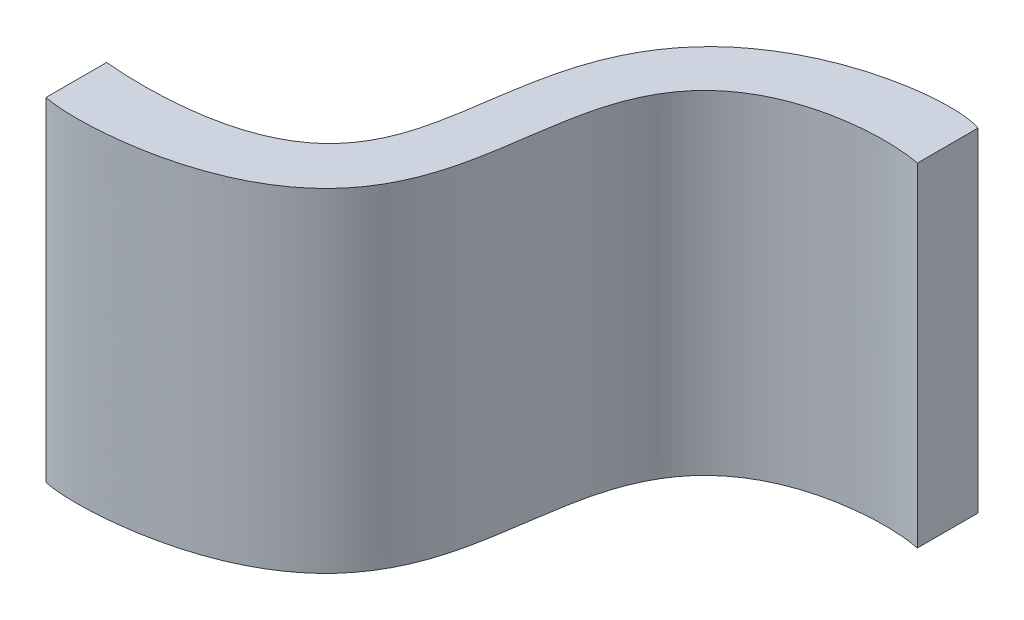
ISO-10303-21;
HEADER;
FILE_DESCRIPTION(('STEP AP214'),'2;1');
FILE_NAME('part.step','',(''),(''),'','','');
FILE_SCHEMA(('AUTOMOTIVE_DESIGN { 1 0 10303 214 1 1 1 1 }'));
ENDSEC;
DATA;
#1=APPLICATION_CONTEXT('core data for automotive mechanical design processes');
#2=APPLICATION_PROTOCOL_DEFINITION('international standard','automotive_design',2000,#1);
#3=PRODUCT_CONTEXT('',#1,'mechanical');
#4=PRODUCT('Part','Part','',(#3));
#5=PRODUCT_RELATED_PRODUCT_CATEGORY('part','',(#4));
#6=PRODUCT_DEFINITION_FORMATION('','',#4);
#7=PRODUCT_DEFINITION_CONTEXT('part definition',#1,'design');
#8=PRODUCT_DEFINITION('design','',#6,#7);
#9=PRODUCT_DEFINITION_SHAPE('','',#8);
#10=(LENGTH_UNIT() NAMED_UNIT(*) SI_UNIT(.MILLI.,.METRE.));
#11=(NAMED_UNIT(*) PLANE_ANGLE_UNIT() SI_UNIT($,.RADIAN.));
#12=(NAMED_UNIT(*) SI_UNIT($,.STERADIAN.) SOLID_ANGLE_UNIT());
#13=UNCERTAINTY_MEASURE_WITH_UNIT(LENGTH_MEASURE(1.E-05),#10,'distance_accuracy_value','');
#14=(GEOMETRIC_REPRESENTATION_CONTEXT(3) GLOBAL_UNCERTAINTY_ASSIGNED_CONTEXT((#13)) GLOBAL_UNIT_ASSIGNED_CONTEXT((#10,
#11,#12)) REPRESENTATION_CONTEXT('',''));
#15=CARTESIAN_POINT('',(0.,0.,0.));
#16=DIRECTION('',(0.,0.,1.));
#17=DIRECTION('',(1.,0.,0.));
#18=AXIS2_PLACEMENT_3D('',#15,#16,#17);
#19=CARTESIAN_POINT('',(1.400000197247,-1.169999763978,0.09));
#20=DIRECTION('',(0.999999999999986,1.68586984372598E-07,0.));
#21=DIRECTION('',(0.,0.,-1.));
#22=AXIS2_PLACEMENT_3D('',#19,#20,#21);
#23=PLANE('',#22);
#24=DIRECTION('',(1.68587434415898E-07,-0.999999999999986,1.72923307616797E-11));
#25=VECTOR('',#24,1.);
#26=CARTESIAN_POINT('',(1.400000123057,-0.7299997639752,0.009999999986517));
#27=LINE('',#26,#25);
#28=CARTESIAN_POINT('',(1.400000123057,-0.7299997639752,0.009999999986517));
#29=VERTEX_POINT('',#28);
#30=CARTESIAN_POINT('',(1.400000197236,-1.169999763977,0.009999999994126));
#31=VERTEX_POINT('',#30);
#32=EDGE_CURVE('E108',#29,#31,#27,.T.);
#33=ORIENTED_EDGE('',*,*,#32,.F.);
#34=DIRECTION('',(-1.360772605478E-10,-6.536438056378E-13,-1.));
#35=VECTOR('',#34,1.);
#36=CARTESIAN_POINT('',(1.400000123068,-0.7299997639751,0.09000000000002));
#37=LINE('',#36,#35);
#38=CARTESIAN_POINT('',(1.400000123068,-0.7299997639751,0.09000000000002));
#39=VERTEX_POINT('',#38);
#40=EDGE_CURVE('E26',#39,#29,#37,.T.);
#41=ORIENTED_EDGE('',*,*,#40,.F.);
#42=DIRECTION('',(-1.68587683206797E-07,0.999999999999986,0.));
#43=VECTOR('',#42,1.);
#44=CARTESIAN_POINT('',(1.400000197247,-1.169999763977,0.08999999999998));
#45=LINE('',#44,#43);
#46=CARTESIAN_POINT('',(1.400000197247,-1.169999763977,0.08999999999998));
#47=VERTEX_POINT('',#46);
#48=EDGE_CURVE('E89',#47,#39,#45,.T.);
#49=ORIENTED_EDGE('',*,*,#48,.F.);
#50=DIRECTION('',(1.374539371112E-10,2.053912595406E-13,1.));
#51=VECTOR('',#50,1.);
#52=CARTESIAN_POINT('',(1.400000197236,-1.169999763977,0.009999999994126));
#53=LINE('',#52,#51);
#54=EDGE_CURVE('E67',#31,#47,#53,.T.);
#55=ORIENTED_EDGE('',*,*,#54,.F.);
#56=EDGE_LOOP('',(#33,#41,#49,#55));
#57=FACE_BOUND('',#56,.T.);
#58=ADVANCED_FACE('F17',(#57),#23,.T.);
#59=CARTESIAN_POINT('',(0.750000197247,-1.16999987356,0.59));
#60=DIRECTION('',(0.999999999999986,1.68586984372598E-07,0.));
#61=DIRECTION('',(0.,0.,-1.));
#62=AXIS2_PLACEMENT_3D('',#59,#60,#61);
#63=PLANE('',#62);
#64=DIRECTION('',(-1.68587428865298E-07,0.999999999999986,0.));
#65=VECTOR('',#64,1.);
#66=CARTESIAN_POINT('',(0.7500001972471,-1.16999987356,0.51));
#67=LINE('',#66,#65);
#68=CARTESIAN_POINT('',(0.7500001972471,-1.16999987356,0.51));
#69=VERTEX_POINT('',#68);
#70=CARTESIAN_POINT('',(0.7500001230686,-0.7299998735591,0.51));
#71=VERTEX_POINT('',#70);
#72=EDGE_CURVE('E111',#69,#71,#67,.T.);
#73=ORIENTED_EDGE('',*,*,#72,.F.);
#74=DIRECTION('',(-2.595146320061E-13,1.729172360854E-12,-1.));
#75=VECTOR('',#74,1.);
#76=CARTESIAN_POINT('',(0.7500001972471,-1.16999987356,0.59));
#77=LINE('',#76,#75);
#78=CARTESIAN_POINT('',(0.7500001972471,-1.16999987356,0.59));
#79=VERTEX_POINT('',#78);
#80=EDGE_CURVE('E81',#79,#69,#77,.T.);
#81=ORIENTED_EDGE('',*,*,#80,.F.);
#82=DIRECTION('',(1.68587678665498E-07,-0.999999999999986,0.));
#83=VECTOR('',#82,1.);
#84=CARTESIAN_POINT('',(0.7500001230685,-0.7299998735593,0.5900000000001));
#85=LINE('',#84,#83);
#86=CARTESIAN_POINT('',(0.7500001230685,-0.7299998735593,0.5900000000001));
#87=VERTEX_POINT('',#86);
#88=EDGE_CURVE('E87',#87,#79,#85,.T.);
#89=ORIENTED_EDGE('',*,*,#88,.F.);
#90=DIRECTION('',(-1.114386360967E-12,-1.27953203588E-12,1.));
#91=VECTOR('',#90,1.);
#92=CARTESIAN_POINT('',(0.7500001230686,-0.7299998735591,0.51));
#93=LINE('',#92,#91);
#94=EDGE_CURVE('E11',#71,#87,#93,.T.);
#95=ORIENTED_EDGE('',*,*,#94,.F.);
#96=EDGE_LOOP('',(#73,#81,#89,#95));
#97=FACE_BOUND('',#96,.T.);
#98=ADVANCED_FACE('F138',(#97),#63,.F.);
#99=CARTESIAN_POINT('',(0.750000123068,-0.72999987356,0.59));
#100=DIRECTION('',(1.68593782819698E-07,-0.999999999999986,0.));
#101=DIRECTION('',(0.,0.,-1.));
#102=AXIS2_PLACEMENT_3D('',#99,#100,#101);
#103=PLANE('',#102);
#104=ORIENTED_EDGE('',*,*,#40,.T.);
#105=CARTESIAN_POINT('',(0.7500001230686,-0.7299998735591,0.51));
#106=CARTESIAN_POINT('',(0.7644218562285,-0.7299998711278,0.5114683296446));
#107=CARTESIAN_POINT('',(0.8021379117589,-0.7299998647677,0.5135090040253));
#108=CARTESIAN_POINT('',(0.8664299345299,-0.7299998539295,0.5097259956063));
#109=CARTESIAN_POINT('',(0.926005585519,-0.7299998438857,0.4965341100573));
#110=CARTESIAN_POINT('',(0.9739022404032,-0.7299998358109,0.4727617093644));
#111=CARTESIAN_POINT('',(1.007682701009,-0.7299998301159,0.4384418622882));
#112=CARTESIAN_POINT('',(1.028476188423,-0.7299998266104,0.3946212927565));
#113=CARTESIAN_POINT('',(1.040022751333,-0.7299998246638,0.343170008632));
#114=CARTESIAN_POINT('',(1.047716759567,-0.7299998233667,0.286590748237));
#115=CARTESIAN_POINT('',(1.057650641587,-0.7299998216919,0.2278284754756));
#116=CARTESIAN_POINT('',(1.075658560988,-0.729999818656,0.1700798628073));
#117=CARTESIAN_POINT('',(1.106360093006,-0.7299998134801,0.1166027742193));
#118=CARTESIAN_POINT('',(1.152203962001,-0.7299998057514,0.07052576034981));
#119=CARTESIAN_POINT('',(1.212511535006,-0.7299997955843,0.03465750501267));
#120=CARTESIAN_POINT('',(1.282521230062,-0.7299997837814,0.01129645396204));
#121=CARTESIAN_POINT('',(1.352429509315,-0.7299997719962,0.002039763298616));
#122=CARTESIAN_POINT('',(1.388439581969,-0.7299997659241,0.005743112475336));
#123=CARTESIAN_POINT('',(1.400000123057,-0.7299997639752,0.009999999986517));
#124=B_SPLINE_CURVE_WITH_KNOTS('',3,(#105,#106,#107,#108,#109,#110,#111,#112,#113,#114,#115,
#116,#117,#118,#119,#120,#121,#122,#123),.UNSPECIFIED.,.F.,.F.,(4,1,1,1,1,1,1,1,1,1,1,1,1,1,1,1,
4),(0.,0.06250000000134,0.1250000000031,0.1875000000049,0.2500000000067,0.3125000000085,
0.3750000000102,0.437500000012,0.5000000000139,0.5625000000157,0.6250000000175,0.6875000000193,
0.7500000000211,0.8125000000229,0.8750000000247,0.9375000000264,1.),.UNSPECIFIED.);
#125=EDGE_CURVE('E114',#71,#29,#124,.T.);
#126=ORIENTED_EDGE('',*,*,#125,.F.);
#127=ORIENTED_EDGE('',*,*,#94,.T.);
#128=CARTESIAN_POINT('',(1.400000123068,-0.7299997639751,0.09000000000002));
#129=CARTESIAN_POINT('',(1.385139425974,-0.7299997664804,0.0869442722624));
#130=CARTESIAN_POINT('',(1.347177183232,-0.7299997728813,0.08395147383047));
#131=CARTESIAN_POINT('',(1.283733356588,-0.7299997835768,0.09085521172895));
#132=CARTESIAN_POINT('',(1.225667169819,-0.7299997933659,0.1098694776559));
#133=CARTESIAN_POINT('',(1.179493854055,-0.7299998011509,0.1405921576274));
#134=CARTESIAN_POINT('',(1.147322244092,-0.7299998065739,0.1816970551319));
#135=CARTESIAN_POINT('',(1.121212737893,-0.7299998109759,0.2475828392578));
#136=CARTESIAN_POINT('',(1.112804672987,-0.7299998123939,0.3249568518059));
#137=CARTESIAN_POINT('',(1.098994778474,-0.7299998147219,0.4017092240574));
#138=CARTESIAN_POINT('',(1.080020975181,-0.7299998179209,0.455859621362));
#139=CARTESIAN_POINT('',(1.047983845502,-0.7299998233219,0.5037736672678));
#140=CARTESIAN_POINT('',(1.000607126795,-0.7299998313089,0.5430418522295));
#141=CARTESIAN_POINT('',(0.9388002073645,-0.7299998417289,0.5718772608218));
#142=CARTESIAN_POINT('',(0.8675884355516,-0.729999853734,0.5893043307076));
#143=CARTESIAN_POINT('',(0.7970692590363,-0.7299998656225,0.5953538459314));
#144=CARTESIAN_POINT('',(0.7612562222042,-0.7299998716617,0.5926205273752));
#145=CARTESIAN_POINT('',(0.7500001230685,-0.7299998735593,0.5900000000001));
#146=B_SPLINE_CURVE_WITH_KNOTS('',3,(#128,#129,#130,#131,#132,#133,#134,#135,#136,#137,#138,
#139,#140,#141,#142,#143,#144,#145),.UNSPECIFIED.,.F.,.F.,(4,1,1,1,1,1,1,1,1,1,1,1,1,1,1,4),(0.,
0.06249999999997,0.125,0.1875,0.2500000000001,0.3125000000001,0.3750000000001,0.5000000000001,
0.5625000000001,0.6250000000001,0.6875000000002,0.7500000000002,0.8125000000002,0.8750000000003,
0.9375000000002,1.),.UNSPECIFIED.);
#147=EDGE_CURVE('E20',#39,#87,#146,.T.);
#148=ORIENTED_EDGE('',*,*,#147,.F.);
#149=EDGE_LOOP('',(#104,#126,#127,#148));
#150=FACE_BOUND('',#149,.T.);
#151=ADVANCED_FACE('F145',(#150),#103,.F.);
#152=CARTESIAN_POINT('',(0.7406827881867,-0.7299998751308,0.5089095823806));
#153=CARTESIAN_POINT('',(0.7435212326685,-0.7299998746523,0.5092915307419));
#154=CARTESIAN_POINT('',(0.7600284958417,-0.7299998718694,0.5112306213833));
#155=CARTESIAN_POINT('',(0.802137911759,-0.7299998647702,0.5135090040253));
#156=CARTESIAN_POINT('',(0.8664299345299,-0.7299998539314,0.5097259956063));
#157=CARTESIAN_POINT('',(0.926005585519,-0.7299998438877,0.4965341100573));
#158=CARTESIAN_POINT('',(0.9739022404032,-0.7299998358129,0.4727617093644));
#159=CARTESIAN_POINT('',(1.007682701009,-0.7299998301179,0.4384418622882));
#160=CARTESIAN_POINT('',(1.028476188423,-0.7299998266124,0.3946212927565));
#161=CARTESIAN_POINT('',(1.040022751333,-0.7299998246658,0.343170008632));
#162=CARTESIAN_POINT('',(1.047716759567,-0.7299998233687,0.286590748237));
#163=CARTESIAN_POINT('',(1.057650641587,-0.7299998216939,0.2278284754756));
#164=CARTESIAN_POINT('',(1.075658560988,-0.729999818658,0.1700798628073));
#165=CARTESIAN_POINT('',(1.106360093006,-0.7299998134821,0.1166027742193));
#166=CARTESIAN_POINT('',(1.152203962001,-0.7299998057534,0.07052576034988));
#167=CARTESIAN_POINT('',(1.212511535006,-0.7299997955863,0.03465750501241));
#168=CARTESIAN_POINT('',(1.282521230061,-0.7299997837835,0.011296453963));
#169=CARTESIAN_POINT('',(1.352429509318,-0.7299997719978,0.00203976329503));
#170=CARTESIAN_POINT('',(1.392618288916,-0.7299997652225,0.006172859213974));
#171=CARTESIAN_POINT('',(1.405019065735,-0.7299997631319,0.01210547686087));
#172=CARTESIAN_POINT('',(1.406960401861,-0.7299997628046,0.01335175299749));
#173=(BOUNDED_CURVE() B_SPLINE_CURVE(3,(#152,#153,#154,#155,#156,#157,#158,#159,#160,#161,#162,
#163,#164,#165,#166,#167,#168,#169,#170,#171,#172),.UNSPECIFIED.,.F.,
.F.) B_SPLINE_CURVE_WITH_KNOTS((4,1,1,1,1,1,1,1,1,1,1,1,1,1,1,1,1,1,4),(0.,0.01414937814874,
0.07488406470077,0.1356187512532,0.1963534378057,0.2570881243582,0.3178228109107,0.378557497463,
0.4392921840155,0.500026870568,0.5607615571205,0.6214962436729,0.6822309302254,0.7429656167779,
0.8037003033304,0.8644349898828,0.9251696764352,0.9859043629603,1.),
.UNSPECIFIED.) CURVE() GEOMETRIC_REPRESENTATION_ITEM() RATIONAL_B_SPLINE_CURVE((1.,1.,1.,1.,1.,
1.,1.,1.,1.,1.,1.,1.,1.,1.,1.,1.,1.,1.,1.,1.,1.)) REPRESENTATION_ITEM(''));
#174=DIRECTION('',(1.68587774599098E-07,-0.999999999999986,0.));
#175=VECTOR('',#174,1.);
#176=SURFACE_OF_LINEAR_EXTRUSION('',#173,#175);
#177=ORIENTED_EDGE('',*,*,#32,.T.);
#178=CARTESIAN_POINT('',(1.400000197236,-1.169999763977,0.009999999994126));
#179=CARTESIAN_POINT('',(1.388439656147,-1.169999765926,0.005743112482945));
#180=CARTESIAN_POINT('',(1.352429583494,-1.169999771997,0.002039763295085));
#181=CARTESIAN_POINT('',(1.28252130424,-1.169999783783,0.01129645396299));
#182=CARTESIAN_POINT('',(1.212511609184,-1.169999795586,0.03465750501241));
#183=CARTESIAN_POINT('',(1.15220403618,-1.169999805753,0.07052576034988));
#184=CARTESIAN_POINT('',(1.106360167185,-1.169999813481,0.1166027742193));
#185=CARTESIAN_POINT('',(1.075658635167,-1.169999818657,0.1700798628073));
#186=CARTESIAN_POINT('',(1.057650715766,-1.169999821693,0.2278284754756));
#187=CARTESIAN_POINT('',(1.047716833746,-1.169999823368,0.286590748237));
#188=CARTESIAN_POINT('',(1.040022825512,-1.169999824665,0.343170008632));
#189=CARTESIAN_POINT('',(1.028476262602,-1.169999826612,0.3946212927565));
#190=CARTESIAN_POINT('',(1.007682775188,-1.169999830117,0.4384418622882));
#191=CARTESIAN_POINT('',(0.9739023145818,-1.169999835812,0.4727617093644));
#192=CARTESIAN_POINT('',(0.9260056596976,-1.169999843887,0.4965341100573));
#193=CARTESIAN_POINT('',(0.8664300087085,-1.169999853931,0.5097259956063));
#194=CARTESIAN_POINT('',(0.8021379859376,-1.169999864769,0.5135090040253));
#195=CARTESIAN_POINT('',(0.7644219304069,-1.169999871128,0.5114683296446));
#196=CARTESIAN_POINT('',(0.7500001972471,-1.16999987356,0.51));
#197=B_SPLINE_CURVE_WITH_KNOTS('',3,(#178,#179,#180,#181,#182,#183,#184,#185,#186,#187,#188,
#189,#190,#191,#192,#193,#194,#195,#196),.UNSPECIFIED.,.F.,.F.,(4,1,1,1,1,1,1,1,1,1,1,1,1,1,1,1,
4),(0.,0.06249999997364,0.1249999999753,0.1874999999771,0.2499999999789,0.3124999999807,
0.3749999999825,0.4374999999843,0.4999999999861,0.562499999988,0.6249999999898,0.6874999999915,
0.7499999999933,0.8124999999951,0.8749999999969,0.9374999999987,1.),.UNSPECIFIED.);
#198=EDGE_CURVE('E77',#31,#69,#197,.T.);
#199=ORIENTED_EDGE('',*,*,#198,.T.);
#200=ORIENTED_EDGE('',*,*,#72,.T.);
#201=ORIENTED_EDGE('',*,*,#125,.T.);
#202=EDGE_LOOP('',(#177,#199,#200,#201));
#203=FACE_BOUND('',#202,.T.);
#204=ADVANCED_FACE('F136',(#203),#176,.T.);
#205=CARTESIAN_POINT('',(0.750000197247,-1.16999987356,0.51));
#206=DIRECTION('',(-1.68589596131297E-07,0.999999999999986,0.));
#207=DIRECTION('',(0.,0.,1.));
#208=AXIS2_PLACEMENT_3D('',#205,#206,#207);
#209=PLANE('',#208);
#210=ORIENTED_EDGE('',*,*,#54,.T.);
#211=CARTESIAN_POINT('',(0.7500001972471,-1.16999987356,0.59));
#212=CARTESIAN_POINT('',(0.7612562963828,-1.169999871662,0.5926205273752));
#213=CARTESIAN_POINT('',(0.7970693332153,-1.169999865624,0.5953538459314));
#214=CARTESIAN_POINT('',(0.8675885097304,-1.169999853735,0.5893043307076));
#215=CARTESIAN_POINT('',(0.9388002815434,-1.16999984173,0.5718772608218));
#216=CARTESIAN_POINT('',(1.000607200974,-1.16999983131,0.5430418522295));
#217=CARTESIAN_POINT('',(1.047983919681,-1.169999823323,0.5037736672678));
#218=CARTESIAN_POINT('',(1.08002104936,-1.169999817922,0.455859621362));
#219=CARTESIAN_POINT('',(1.098994852653,-1.169999814723,0.4017092240574));
#220=CARTESIAN_POINT('',(1.112804747166,-1.169999812395,0.3249568518059));
#221=CARTESIAN_POINT('',(1.121212812072,-1.169999810977,0.2475828392578));
#222=CARTESIAN_POINT('',(1.147322318271,-1.169999806575,0.1816970551319));
#223=CARTESIAN_POINT('',(1.179493928234,-1.169999801152,0.1405921576274));
#224=CARTESIAN_POINT('',(1.225667243998,-1.169999793367,0.1098694776559));
#225=CARTESIAN_POINT('',(1.283733430767,-1.169999783578,0.09085521172895));
#226=CARTESIAN_POINT('',(1.347177257411,-1.169999772882,0.08395147383049));
#227=CARTESIAN_POINT('',(1.385139500152,-1.169999766482,0.08694427226236));
#228=CARTESIAN_POINT('',(1.400000197247,-1.169999763977,0.08999999999998));
#229=B_SPLINE_CURVE_WITH_KNOTS('',3,(#211,#212,#213,#214,#215,#216,#217,#218,#219,#220,#221,
#222,#223,#224,#225,#226,#227,#228),.UNSPECIFIED.,.F.,.F.,(4,1,1,1,1,1,1,1,1,1,1,1,1,1,1,4),(0.,
0.06249999999975,0.1249999999997,0.1874999999998,0.2499999999998,0.3124999999998,
0.3749999999999,0.4374999999999,0.4999999999999,0.6249999999999,0.6874999999999,0.7499999999999,
0.8125,0.875,0.9375,1.),.UNSPECIFIED.);
#230=EDGE_CURVE('E73',#79,#47,#229,.T.);
#231=ORIENTED_EDGE('',*,*,#230,.F.);
#232=ORIENTED_EDGE('',*,*,#80,.T.);
#233=ORIENTED_EDGE('',*,*,#198,.F.);
#234=EDGE_LOOP('',(#210,#231,#232,#233));
#235=FACE_BOUND('',#234,.T.);
#236=ADVANCED_FACE('F75',(#235),#209,.F.);
#237=CARTESIAN_POINT('',(0.7413635234873,-1.169999875016,0.5871134484554));
#238=CARTESIAN_POINT('',(0.7434772967347,-1.16999987466,0.5881944663868));
#239=CARTESIAN_POINT('',(0.7555262104896,-1.169999872629,0.5921831964062));
#240=CARTESIAN_POINT('',(0.7970693332153,-1.169999865625,0.5953538459314));
#241=CARTESIAN_POINT('',(0.8675885097304,-1.169999853736,0.5893043307076));
#242=CARTESIAN_POINT('',(0.9388002815434,-1.169999841731,0.5718772608218));
#243=CARTESIAN_POINT('',(1.000607200974,-1.169999831311,0.5430418522295));
#244=CARTESIAN_POINT('',(1.047983919681,-1.169999823324,0.5037736672678));
#245=CARTESIAN_POINT('',(1.08002104936,-1.169999817923,0.455859621362));
#246=CARTESIAN_POINT('',(1.098994852653,-1.169999814724,0.4017092240574));
#247=CARTESIAN_POINT('',(1.112804747166,-1.169999812396,0.3249568518059));
#248=CARTESIAN_POINT('',(1.121212812072,-1.169999810978,0.2475828392578));
#249=CARTESIAN_POINT('',(1.147322318271,-1.169999806576,0.1816970551319));
#250=CARTESIAN_POINT('',(1.179493928234,-1.169999801153,0.1405921576274));
#251=CARTESIAN_POINT('',(1.225667243998,-1.169999793368,0.1098694776559));
#252=CARTESIAN_POINT('',(1.283733430767,-1.169999783579,0.09085521172895));
#253=CARTESIAN_POINT('',(1.347177257411,-1.169999772883,0.08395147383048));
#254=CARTESIAN_POINT('',(1.388890585023,-1.169999765851,0.08723999348714));
#255=CARTESIAN_POINT('',(1.405712874286,-1.169999763015,0.09126865596515));
#256=CARTESIAN_POINT('',(1.408304392026,-1.169999762578,0.09199171170693));
#257=(BOUNDED_CURVE() B_SPLINE_CURVE(3,(#237,#238,#239,#240,#241,#242,#243,#244,#245,#246,#247,
#248,#249,#250,#251,#252,#253,#254,#255,#256),.UNSPECIFIED.,.F.,
.F.) B_SPLINE_CURVE_WITH_KNOTS((4,1,1,1,1,1,1,1,1,1,1,1,1,1,1,1,1,4),(0.,0.01937324890595,
0.07991465173759,0.1404560545694,0.2009974574014,0.2615388602333,0.3220802630652,
0.3826216658971,0.443163068729,0.5037044715609,0.6247872772246,0.6853286800565,0.7458700828884,
0.8064114857203,0.8669528885523,0.9274942913842,0.988035694216,1.),
.UNSPECIFIED.) CURVE() GEOMETRIC_REPRESENTATION_ITEM() RATIONAL_B_SPLINE_CURVE((1.,1.,1.,1.,1.,
1.,1.,1.,1.,1.,1.,1.,1.,1.,1.,1.,1.,1.,1.,1.)) REPRESENTATION_ITEM(''));
#258=DIRECTION('',(-1.68588335715898E-07,0.999999999999986,0.));
#259=VECTOR('',#258,1.);
#260=SURFACE_OF_LINEAR_EXTRUSION('',#257,#259);
#261=ORIENTED_EDGE('',*,*,#48,.T.);
#262=ORIENTED_EDGE('',*,*,#147,.T.);
#263=ORIENTED_EDGE('',*,*,#88,.T.);
#264=ORIENTED_EDGE('',*,*,#230,.T.);
#265=EDGE_LOOP('',(#261,#262,#263,#264));
#266=FACE_BOUND('',#265,.T.);
#267=ADVANCED_FACE('F84',(#266),#260,.T.);
#268=CLOSED_SHELL('',(#58,#98,#151,#204,#236,#267));
#269=MANIFOLD_SOLID_BREP('B1',#268);
#270=ADVANCED_BREP_SHAPE_REPRESENTATION('',(#18,#269),#14);
#271=SHAPE_DEFINITION_REPRESENTATION(#9,#270);
ENDSEC;
END-ISO-10303-21;
